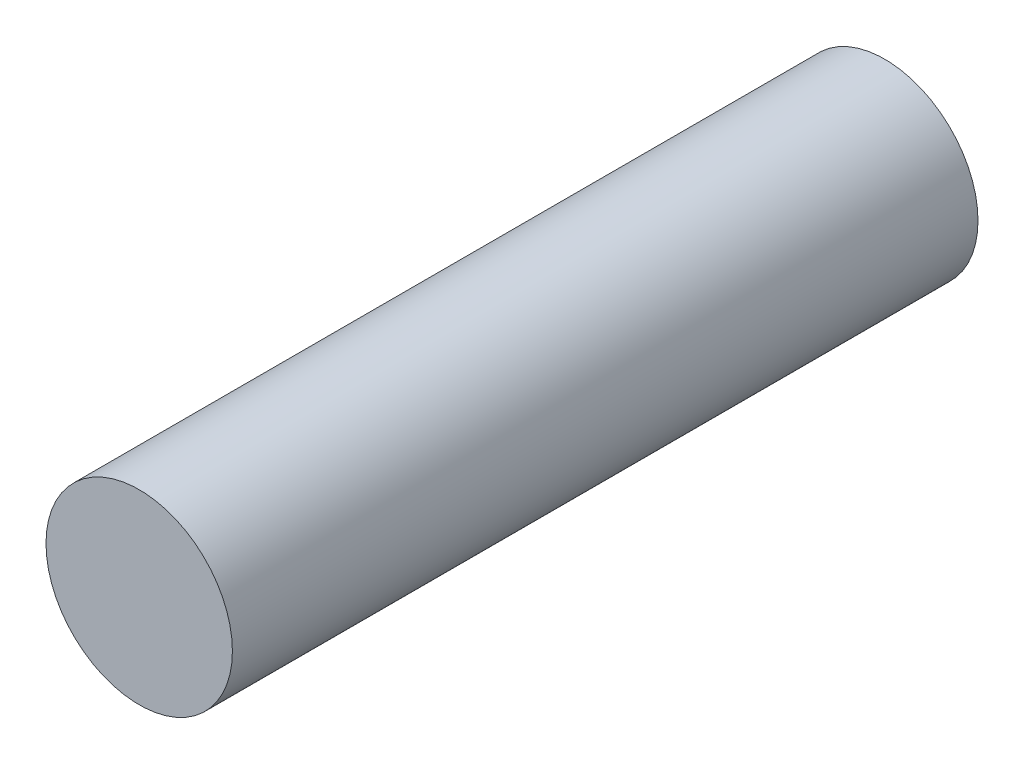
ISO-10303-21;
HEADER;
FILE_DESCRIPTION(('STEP AP214'),'2;1');
FILE_NAME('part.step','',(''),(''),'','','');
FILE_SCHEMA(('AUTOMOTIVE_DESIGN { 1 0 10303 214 1 1 1 1 }'));
ENDSEC;
DATA;
#1=APPLICATION_CONTEXT('core data for automotive mechanical design processes');
#2=APPLICATION_PROTOCOL_DEFINITION('international standard','automotive_design',2000,#1);
#3=PRODUCT_CONTEXT('',#1,'mechanical');
#4=PRODUCT('Part','Part','',(#3));
#5=PRODUCT_RELATED_PRODUCT_CATEGORY('part','',(#4));
#6=PRODUCT_DEFINITION_FORMATION('','',#4);
#7=PRODUCT_DEFINITION_CONTEXT('part definition',#1,'design');
#8=PRODUCT_DEFINITION('design','',#6,#7);
#9=PRODUCT_DEFINITION_SHAPE('','',#8);
#10=(LENGTH_UNIT() NAMED_UNIT(*) SI_UNIT(.MILLI.,.METRE.));
#11=(NAMED_UNIT(*) PLANE_ANGLE_UNIT() SI_UNIT($,.RADIAN.));
#12=(NAMED_UNIT(*) SI_UNIT($,.STERADIAN.) SOLID_ANGLE_UNIT());
#13=UNCERTAINTY_MEASURE_WITH_UNIT(LENGTH_MEASURE(1.E-05),#10,'distance_accuracy_value','');
#14=(GEOMETRIC_REPRESENTATION_CONTEXT(3) GLOBAL_UNCERTAINTY_ASSIGNED_CONTEXT((#13)) GLOBAL_UNIT_ASSIGNED_CONTEXT((#10,
#11,#12)) REPRESENTATION_CONTEXT('',''));
#15=CARTESIAN_POINT('',(0.,0.,0.));
#16=DIRECTION('',(0.,0.,1.));
#17=DIRECTION('',(1.,0.,0.));
#18=AXIS2_PLACEMENT_3D('',#15,#16,#17);
#19=CARTESIAN_POINT('',(0.,0.,70.));
#20=DIRECTION('',(0.,0.,-1.));
#21=DIRECTION('',(-1.,0.,0.));
#22=AXIS2_PLACEMENT_3D('',#19,#20,#21);
#23=CYLINDRICAL_SURFACE('',#22,17.5);
#24=CARTESIAN_POINT('',(0.,0.,70.));
#25=DIRECTION('',(0.,0.,1.));
#26=DIRECTION('',(1.,0.,0.));
#27=AXIS2_PLACEMENT_3D('',#24,#25,#26);
#28=CIRCLE('',#27,17.5);
#29=CARTESIAN_POINT('',(17.5,0.,70.));
#30=VERTEX_POINT('',#29);
#31=EDGE_CURVE('E10',#30,#30,#28,.T.);
#32=ORIENTED_EDGE('',*,*,#31,.F.);
#33=EDGE_LOOP('',(#32));
#34=FACE_BOUND('',#33,.T.);
#35=CARTESIAN_POINT('',(0.,0.,-70.));
#36=DIRECTION('',(0.,0.,1.));
#37=DIRECTION('',(1.,0.,0.));
#38=AXIS2_PLACEMENT_3D('',#35,#36,#37);
#39=CIRCLE('',#38,17.5);
#40=CARTESIAN_POINT('',(17.5,0.,-70.));
#41=VERTEX_POINT('',#40);
#42=EDGE_CURVE('E34',#41,#41,#39,.T.);
#43=ORIENTED_EDGE('',*,*,#42,.T.);
#44=EDGE_LOOP('',(#43));
#45=FACE_BOUND('',#44,.T.);
#46=ADVANCED_FACE('F31',(#34,#45),#23,.T.);
#47=CARTESIAN_POINT('',(0.,0.,70.));
#48=DIRECTION('',(0.,0.,1.));
#49=DIRECTION('',(1.,0.,0.));
#50=AXIS2_PLACEMENT_3D('',#47,#48,#49);
#51=PLANE('',#50);
#52=ORIENTED_EDGE('',*,*,#31,.T.);
#53=EDGE_LOOP('',(#52));
#54=FACE_BOUND('',#53,.T.);
#55=ADVANCED_FACE('F46',(#54),#51,.T.);
#56=CARTESIAN_POINT('',(0.,0.,-70.));
#57=DIRECTION('',(0.,0.,1.));
#58=DIRECTION('',(1.,0.,0.));
#59=AXIS2_PLACEMENT_3D('',#56,#57,#58);
#60=PLANE('',#59);
#61=ORIENTED_EDGE('',*,*,#42,.F.);
#62=EDGE_LOOP('',(#61));
#63=FACE_BOUND('',#62,.T.);
#64=ADVANCED_FACE('F44',(#63),#60,.F.);
#65=CLOSED_SHELL('',(#46,#55,#64));
#66=MANIFOLD_SOLID_BREP('B2',#65);
#67=ADVANCED_BREP_SHAPE_REPRESENTATION('',(#18,#66),#14);
#68=SHAPE_DEFINITION_REPRESENTATION(#9,#67);
ENDSEC;
END-ISO-10303-21;
